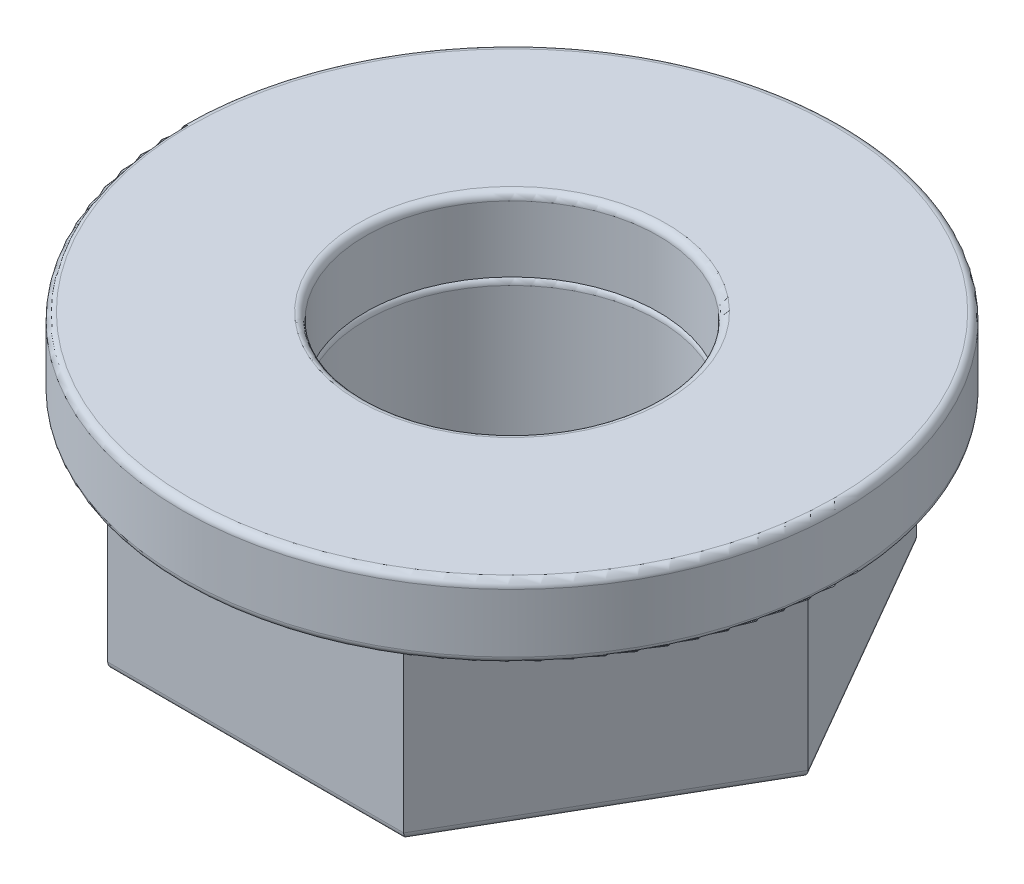
ISO-10303-21;
HEADER;
FILE_DESCRIPTION(('STEP AP214'),'2;1');
FILE_NAME('part.step','',(''),(''),'','','');
FILE_SCHEMA(('AUTOMOTIVE_DESIGN { 1 0 10303 214 1 1 1 1 }'));
ENDSEC;
DATA;
#1=APPLICATION_CONTEXT('core data for automotive mechanical design processes');
#2=APPLICATION_PROTOCOL_DEFINITION('international standard','automotive_design',2000,#1);
#3=PRODUCT_CONTEXT('',#1,'mechanical');
#4=PRODUCT('Part','Part','',(#3));
#5=PRODUCT_RELATED_PRODUCT_CATEGORY('part','',(#4));
#6=PRODUCT_DEFINITION_FORMATION('','',#4);
#7=PRODUCT_DEFINITION_CONTEXT('part definition',#1,'design');
#8=PRODUCT_DEFINITION('design','',#6,#7);
#9=PRODUCT_DEFINITION_SHAPE('','',#8);
#10=(LENGTH_UNIT() NAMED_UNIT(*) SI_UNIT(.MILLI.,.METRE.));
#11=(NAMED_UNIT(*) PLANE_ANGLE_UNIT() SI_UNIT($,.RADIAN.));
#12=(NAMED_UNIT(*) SI_UNIT($,.STERADIAN.) SOLID_ANGLE_UNIT());
#13=UNCERTAINTY_MEASURE_WITH_UNIT(LENGTH_MEASURE(1.E-05),#10,'distance_accuracy_value','');
#14=(GEOMETRIC_REPRESENTATION_CONTEXT(3) GLOBAL_UNCERTAINTY_ASSIGNED_CONTEXT((#13)) GLOBAL_UNIT_ASSIGNED_CONTEXT((#10,
#11,#12)) REPRESENTATION_CONTEXT('',''));
#15=CARTESIAN_POINT('',(0.,0.,0.));
#16=DIRECTION('',(0.,0.,1.));
#17=DIRECTION('',(1.,0.,0.));
#18=AXIS2_PLACEMENT_3D('',#15,#16,#17);
#19=CARTESIAN_POINT('',(0.,0.,0.));
#20=DIRECTION('',(0.,1.,0.));
#21=DIRECTION('',(0.,0.,1.));
#22=AXIS2_PLACEMENT_3D('',#19,#20,#21);
#23=PLANE('',#22);
#24=CARTESIAN_POINT('',(0.,0.,0.));
#25=DIRECTION('',(0.,1.,0.));
#26=DIRECTION('',(0.,0.,1.));
#27=AXIS2_PLACEMENT_3D('',#24,#25,#26);
#28=CIRCLE('',#27,2.1);
#29=CARTESIAN_POINT('',(0.,0.,2.1));
#30=VERTEX_POINT('',#29);
#31=EDGE_CURVE('E375',#30,#30,#28,.T.);
#32=ORIENTED_EDGE('',*,*,#31,.T.);
#33=EDGE_LOOP('',(#32));
#34=FACE_BOUND('',#33,.T.);
#35=DIRECTION('',(-0.5,0.,-0.866025403784438));
#36=VECTOR('',#35,1.);
#37=CARTESIAN_POINT('',(2.94448637286709,0.,-1.7));
#38=LINE('',#37,#36);
#39=CARTESIAN_POINT('',(1.96299091524473,0.,-3.4));
#40=VERTEX_POINT('',#39);
#41=CARTESIAN_POINT('',(3.92598183048946,0.,0.));
#42=VERTEX_POINT('',#41);
#43=EDGE_CURVE('E370',#40,#42,#38,.F.);
#44=ORIENTED_EDGE('',*,*,#43,.T.);
#45=DIRECTION('',(0.5,0.,-0.866025403784439));
#46=VECTOR('',#45,1.);
#47=CARTESIAN_POINT('',(2.94448637286709,0.,1.7));
#48=LINE('',#47,#46);
#49=CARTESIAN_POINT('',(1.96299091524473,0.,3.4));
#50=VERTEX_POINT('',#49);
#51=EDGE_CURVE('E372',#42,#50,#48,.F.);
#52=ORIENTED_EDGE('',*,*,#51,.T.);
#53=DIRECTION('',(1.,0.,0.));
#54=VECTOR('',#53,1.);
#55=CARTESIAN_POINT('',(0.,0.,3.4));
#56=LINE('',#55,#54);
#57=CARTESIAN_POINT('',(-1.96299091524473,0.,3.4));
#58=VERTEX_POINT('',#57);
#59=EDGE_CURVE('E362',#50,#58,#56,.F.);
#60=ORIENTED_EDGE('',*,*,#59,.T.);
#61=DIRECTION('',(0.5,0.,0.866025403784439));
#62=VECTOR('',#61,1.);
#63=CARTESIAN_POINT('',(-2.94448637286709,0.,1.7));
#64=LINE('',#63,#62);
#65=CARTESIAN_POINT('',(-3.92598183048946,0.,0.));
#66=VERTEX_POINT('',#65);
#67=EDGE_CURVE('E364',#58,#66,#64,.F.);
#68=ORIENTED_EDGE('',*,*,#67,.T.);
#69=DIRECTION('',(-0.5,0.,0.866025403784439));
#70=VECTOR('',#69,1.);
#71=CARTESIAN_POINT('',(-2.94448637286709,0.,-1.7));
#72=LINE('',#71,#70);
#73=CARTESIAN_POINT('',(-1.96299091524473,0.,-3.4));
#74=VERTEX_POINT('',#73);
#75=EDGE_CURVE('E366',#66,#74,#72,.F.);
#76=ORIENTED_EDGE('',*,*,#75,.T.);
#77=DIRECTION('',(-1.,0.,0.));
#78=VECTOR('',#77,1.);
#79=CARTESIAN_POINT('',(0.,0.,-3.4));
#80=LINE('',#79,#78);
#81=EDGE_CURVE('E368',#74,#40,#80,.F.);
#82=ORIENTED_EDGE('',*,*,#81,.T.);
#83=EDGE_LOOP('',(#44,#52,#60,#68,#76,#82));
#84=FACE_BOUND('',#83,.T.);
#85=ADVANCED_FACE('F32',(#34,#84),#23,.F.);
#86=CARTESIAN_POINT('',(-2.02072594216369,2.5,3.5));
#87=DIRECTION('',(0.,0.,-1.));
#88=DIRECTION('',(-1.,0.,0.));
#89=AXIS2_PLACEMENT_3D('',#86,#87,#88);
#90=PLANE('',#89);
#91=DIRECTION('',(0.,-1.,0.));
#92=VECTOR('',#91,1.);
#93=CARTESIAN_POINT('',(-2.02072594216369,2.5,3.5));
#94=LINE('',#93,#92);
#95=CARTESIAN_POINT('',(-2.02072594216369,2.4,3.5));
#96=VERTEX_POINT('',#95);
#97=CARTESIAN_POINT('',(-2.02072594216369,0.0999999999999998,3.5));
#98=VERTEX_POINT('',#97);
#99=EDGE_CURVE('E174',#96,#98,#94,.T.);
#100=ORIENTED_EDGE('',*,*,#99,.T.);
#101=DIRECTION('',(1.,0.,0.));
#102=VECTOR('',#101,1.);
#103=CARTESIAN_POINT('',(-2.02072594216369,0.0999999999999998,3.5));
#104=LINE('',#103,#102);
#105=CARTESIAN_POINT('',(2.02072594216369,0.0999999999999998,3.5));
#106=VERTEX_POINT('',#105);
#107=EDGE_CURVE('E135',#98,#106,#104,.T.);
#108=ORIENTED_EDGE('',*,*,#107,.T.);
#109=DIRECTION('',(0.,-1.,0.));
#110=VECTOR('',#109,1.);
#111=CARTESIAN_POINT('',(2.02072594216369,2.5,3.5));
#112=LINE('',#111,#110);
#113=CARTESIAN_POINT('',(2.02072594216369,2.4,3.5));
#114=VERTEX_POINT('',#113);
#115=EDGE_CURVE('E360',#114,#106,#112,.T.);
#116=ORIENTED_EDGE('',*,*,#115,.F.);
#117=DIRECTION('',(1.,0.,0.));
#118=VECTOR('',#117,1.);
#119=CARTESIAN_POINT('',(-2.02072594216369,2.4,3.5));
#120=LINE('',#119,#118);
#121=EDGE_CURVE('E334',#114,#96,#120,.F.);
#122=ORIENTED_EDGE('',*,*,#121,.T.);
#123=EDGE_LOOP('',(#100,#108,#116,#122));
#124=FACE_BOUND('',#123,.T.);
#125=ADVANCED_FACE('F214',(#124),#90,.F.);
#126=CARTESIAN_POINT('',(2.02072594216369,2.5,3.5));
#127=DIRECTION('',(-0.866025403784439,0.,-0.5));
#128=DIRECTION('',(-0.5,0.,0.866025403784439));
#129=AXIS2_PLACEMENT_3D('',#126,#127,#128);
#130=PLANE('',#129);
#131=ORIENTED_EDGE('',*,*,#115,.T.);
#132=DIRECTION('',(0.5,0.,-0.866025403784439));
#133=VECTOR('',#132,1.);
#134=CARTESIAN_POINT('',(2.02072594216369,0.0999999999999998,3.5));
#135=LINE('',#134,#133);
#136=CARTESIAN_POINT('',(4.04145188432738,0.0999999999999998,0.));
#137=VERTEX_POINT('',#136);
#138=EDGE_CURVE('E310',#106,#137,#135,.T.);
#139=ORIENTED_EDGE('',*,*,#138,.T.);
#140=DIRECTION('',(0.,-1.,0.));
#141=VECTOR('',#140,1.);
#142=CARTESIAN_POINT('',(4.04145188432738,2.5,0.));
#143=LINE('',#142,#141);
#144=CARTESIAN_POINT('',(4.04145188432738,2.4,0.));
#145=VERTEX_POINT('',#144);
#146=EDGE_CURVE('E357',#145,#137,#143,.T.);
#147=ORIENTED_EDGE('',*,*,#146,.F.);
#148=DIRECTION('',(0.5,0.,-0.866025403784439));
#149=VECTOR('',#148,1.);
#150=CARTESIAN_POINT('',(2.02072594216369,2.4,3.5));
#151=LINE('',#150,#149);
#152=EDGE_CURVE('E306',#145,#114,#151,.F.);
#153=ORIENTED_EDGE('',*,*,#152,.T.);
#154=EDGE_LOOP('',(#131,#139,#147,#153));
#155=FACE_BOUND('',#154,.T.);
#156=ADVANCED_FACE('F220',(#155),#130,.F.);
#157=CARTESIAN_POINT('',(4.04145188432738,2.5,0.));
#158=DIRECTION('',(-0.866025403784438,0.,0.5));
#159=DIRECTION('',(0.5,0.,0.866025403784438));
#160=AXIS2_PLACEMENT_3D('',#157,#158,#159);
#161=PLANE('',#160);
#162=ORIENTED_EDGE('',*,*,#146,.T.);
#163=DIRECTION('',(-0.5,0.,-0.866025403784438));
#164=VECTOR('',#163,1.);
#165=CARTESIAN_POINT('',(4.04145188432738,0.0999999999999998,0.));
#166=LINE('',#165,#164);
#167=CARTESIAN_POINT('',(2.02072594216369,0.0999999999999998,-3.5));
#168=VERTEX_POINT('',#167);
#169=EDGE_CURVE('E321',#137,#168,#166,.T.);
#170=ORIENTED_EDGE('',*,*,#169,.T.);
#171=DIRECTION('',(0.,-1.,0.));
#172=VECTOR('',#171,1.);
#173=CARTESIAN_POINT('',(2.02072594216369,2.5,-3.5));
#174=LINE('',#173,#172);
#175=CARTESIAN_POINT('',(2.02072594216369,2.4,-3.5));
#176=VERTEX_POINT('',#175);
#177=EDGE_CURVE('E351',#176,#168,#174,.T.);
#178=ORIENTED_EDGE('',*,*,#177,.F.);
#179=DIRECTION('',(-0.5,0.,-0.866025403784438));
#180=VECTOR('',#179,1.);
#181=CARTESIAN_POINT('',(4.04145188432738,2.4,0.));
#182=LINE('',#181,#180);
#183=EDGE_CURVE('E303',#176,#145,#182,.F.);
#184=ORIENTED_EDGE('',*,*,#183,.T.);
#185=EDGE_LOOP('',(#162,#170,#178,#184));
#186=FACE_BOUND('',#185,.T.);
#187=ADVANCED_FACE('F240',(#186),#161,.F.);
#188=CARTESIAN_POINT('',(2.02072594216369,2.5,-3.5));
#189=DIRECTION('',(0.,0.,1.));
#190=DIRECTION('',(1.,0.,0.));
#191=AXIS2_PLACEMENT_3D('',#188,#189,#190);
#192=PLANE('',#191);
#193=ORIENTED_EDGE('',*,*,#177,.T.);
#194=DIRECTION('',(-1.,0.,0.));
#195=VECTOR('',#194,1.);
#196=CARTESIAN_POINT('',(2.02072594216369,0.0999999999999998,-3.5));
#197=LINE('',#196,#195);
#198=CARTESIAN_POINT('',(-2.02072594216369,0.0999999999999998,-3.5));
#199=VERTEX_POINT('',#198);
#200=EDGE_CURVE('E325',#168,#199,#197,.T.);
#201=ORIENTED_EDGE('',*,*,#200,.T.);
#202=DIRECTION('',(0.,-1.,0.));
#203=VECTOR('',#202,1.);
#204=CARTESIAN_POINT('',(-2.02072594216369,2.5,-3.5));
#205=LINE('',#204,#203);
#206=CARTESIAN_POINT('',(-2.02072594216369,2.4,-3.5));
#207=VERTEX_POINT('',#206);
#208=EDGE_CURVE('E349',#207,#199,#205,.T.);
#209=ORIENTED_EDGE('',*,*,#208,.F.);
#210=DIRECTION('',(-1.,0.,0.));
#211=VECTOR('',#210,1.);
#212=CARTESIAN_POINT('',(2.02072594216369,2.4,-3.5));
#213=LINE('',#212,#211);
#214=EDGE_CURVE('E323',#207,#176,#213,.F.);
#215=ORIENTED_EDGE('',*,*,#214,.T.);
#216=EDGE_LOOP('',(#193,#201,#209,#215));
#217=FACE_BOUND('',#216,.T.);
#218=ADVANCED_FACE('F236',(#217),#192,.F.);
#219=CARTESIAN_POINT('',(-2.02072594216369,2.5,-3.5));
#220=DIRECTION('',(0.866025403784439,0.,0.5));
#221=DIRECTION('',(0.5,0.,-0.866025403784439));
#222=AXIS2_PLACEMENT_3D('',#219,#220,#221);
#223=PLANE('',#222);
#224=ORIENTED_EDGE('',*,*,#208,.T.);
#225=DIRECTION('',(-0.5,0.,0.866025403784439));
#226=VECTOR('',#225,1.);
#227=CARTESIAN_POINT('',(-2.02072594216369,0.0999999999999998,-3.5));
#228=LINE('',#227,#226);
#229=CARTESIAN_POINT('',(-4.04145188432738,0.0999999999999998,0.));
#230=VERTEX_POINT('',#229);
#231=EDGE_CURVE('E329',#199,#230,#228,.T.);
#232=ORIENTED_EDGE('',*,*,#231,.T.);
#233=DIRECTION('',(0.,-1.,0.));
#234=VECTOR('',#233,1.);
#235=CARTESIAN_POINT('',(-4.04145188432738,2.5,0.));
#236=LINE('',#235,#234);
#237=CARTESIAN_POINT('',(-4.04145188432738,2.4,0.));
#238=VERTEX_POINT('',#237);
#239=EDGE_CURVE('E345',#238,#230,#236,.T.);
#240=ORIENTED_EDGE('',*,*,#239,.F.);
#241=DIRECTION('',(-0.5,0.,0.866025403784439));
#242=VECTOR('',#241,1.);
#243=CARTESIAN_POINT('',(-2.02072594216369,2.4,-3.5));
#244=LINE('',#243,#242);
#245=EDGE_CURVE('E327',#238,#207,#244,.F.);
#246=ORIENTED_EDGE('',*,*,#245,.T.);
#247=EDGE_LOOP('',(#224,#232,#240,#246));
#248=FACE_BOUND('',#247,.T.);
#249=ADVANCED_FACE('F232',(#248),#223,.F.);
#250=CARTESIAN_POINT('',(-4.04145188432738,2.5,0.));
#251=DIRECTION('',(0.866025403784439,0.,-0.5));
#252=DIRECTION('',(-0.5,0.,-0.866025403784439));
#253=AXIS2_PLACEMENT_3D('',#250,#251,#252);
#254=PLANE('',#253);
#255=ORIENTED_EDGE('',*,*,#239,.T.);
#256=DIRECTION('',(0.5,0.,0.866025403784439));
#257=VECTOR('',#256,1.);
#258=CARTESIAN_POINT('',(-4.04145188432738,0.0999999999999998,0.));
#259=LINE('',#258,#257);
#260=EDGE_CURVE('E332',#230,#98,#259,.T.);
#261=ORIENTED_EDGE('',*,*,#260,.T.);
#262=ORIENTED_EDGE('',*,*,#99,.F.);
#263=DIRECTION('',(0.5,0.,0.866025403784439));
#264=VECTOR('',#263,1.);
#265=CARTESIAN_POINT('',(-4.04145188432738,2.4,0.));
#266=LINE('',#265,#264);
#267=EDGE_CURVE('E143',#96,#238,#266,.F.);
#268=ORIENTED_EDGE('',*,*,#267,.T.);
#269=EDGE_LOOP('',(#255,#261,#262,#268));
#270=FACE_BOUND('',#269,.T.);
#271=ADVANCED_FACE('F229',(#270),#254,.F.);
#272=CARTESIAN_POINT('',(0.,2.5,0.));
#273=DIRECTION('',(0.,-1.,0.));
#274=DIRECTION('',(0.,0.,-1.));
#275=AXIS2_PLACEMENT_3D('',#272,#273,#274);
#276=CYLINDRICAL_SURFACE('',#275,2.);
#277=CARTESIAN_POINT('',(0.,0.0999999999999998,0.));
#278=DIRECTION('',(0.,1.,0.));
#279=DIRECTION('',(0.,0.,1.));
#280=AXIS2_PLACEMENT_3D('',#277,#278,#279);
#281=CIRCLE('',#280,2.);
#282=CARTESIAN_POINT('',(0.,0.0999999999999998,2.));
#283=VERTEX_POINT('',#282);
#284=EDGE_CURVE('E311',#283,#283,#281,.F.);
#285=ORIENTED_EDGE('',*,*,#284,.T.);
#286=EDGE_LOOP('',(#285));
#287=FACE_BOUND('',#286,.T.);
#288=CARTESIAN_POINT('',(0.,2.4,0.));
#289=DIRECTION('',(0.,1.,0.));
#290=DIRECTION('',(0.,0.,1.));
#291=AXIS2_PLACEMENT_3D('',#288,#289,#290);
#292=CIRCLE('',#291,2.);
#293=CARTESIAN_POINT('',(0.,2.4,2.));
#294=VERTEX_POINT('',#293);
#295=EDGE_CURVE('E316',#294,#294,#292,.T.);
#296=ORIENTED_EDGE('',*,*,#295,.T.);
#297=EDGE_LOOP('',(#296));
#298=FACE_BOUND('',#297,.T.);
#299=ADVANCED_FACE('F227',(#287,#298),#276,.F.);
#300=CARTESIAN_POINT('',(0.,0.0999999999999998,0.));
#301=DIRECTION('',(0.,1.,0.));
#302=DIRECTION('',(0.,0.,1.));
#303=AXIS2_PLACEMENT_3D('',#300,#301,#302);
#304=TOROIDAL_SURFACE('',#303,2.1,0.1);
#305=ORIENTED_EDGE('',*,*,#284,.F.);
#306=EDGE_LOOP('',(#305));
#307=FACE_BOUND('',#306,.T.);
#308=ORIENTED_EDGE('',*,*,#31,.F.);
#309=EDGE_LOOP('',(#308));
#310=FACE_BOUND('',#309,.T.);
#311=ADVANCED_FACE('F248',(#307,#310),#304,.T.);
#312=CARTESIAN_POINT('',(-1.93412340178525,0.0999999999999998,-3.45));
#313=DIRECTION('',(-0.5,0.,0.866025403784439));
#314=DIRECTION('',(0.866025403784439,0.,0.5));
#315=AXIS2_PLACEMENT_3D('',#312,#313,#314);
#316=CYLINDRICAL_SURFACE('',#315,0.1);
#317=CARTESIAN_POINT('',(-1.96299091524473,0.0999999999999998,-3.4));
#318=DIRECTION('',(-0.866025403784438,0.,0.5));
#319=DIRECTION('',(0.5,0.,0.866025403784439));
#320=AXIS2_PLACEMENT_3D('',#317,#318,#319);
#321=ELLIPSE('',#320,0.115470053837925,0.1);
#322=EDGE_CURVE('E169',#74,#199,#321,.F.);
#323=ORIENTED_EDGE('',*,*,#322,.F.);
#324=ORIENTED_EDGE('',*,*,#75,.F.);
#325=CARTESIAN_POINT('',(-3.92598183048946,0.0999999999999998,0.));
#326=DIRECTION('',(0.,0.,1.));
#327=DIRECTION('',(1.,0.,0.));
#328=AXIS2_PLACEMENT_3D('',#325,#326,#327);
#329=ELLIPSE('',#328,0.115470053837925,0.1);
#330=EDGE_CURVE('E172',#230,#66,#329,.T.);
#331=ORIENTED_EDGE('',*,*,#330,.F.);
#332=ORIENTED_EDGE('',*,*,#231,.F.);
#333=EDGE_LOOP('',(#323,#324,#331,#332));
#334=FACE_BOUND('',#333,.T.);
#335=ADVANCED_FACE('F251',(#334),#316,.T.);
#336=CARTESIAN_POINT('',(-3.95484934394894,0.0999999999999998,-0.0500000000000002));
#337=DIRECTION('',(0.5,0.,0.866025403784439));
#338=DIRECTION('',(0.866025403784439,0.,-0.5));
#339=AXIS2_PLACEMENT_3D('',#336,#337,#338);
#340=CYLINDRICAL_SURFACE('',#339,0.1);
#341=ORIENTED_EDGE('',*,*,#330,.T.);
#342=ORIENTED_EDGE('',*,*,#67,.F.);
#343=CARTESIAN_POINT('',(-1.96299091524473,0.0999999999999998,3.4));
#344=DIRECTION('',(0.866025403784439,0.,0.5));
#345=DIRECTION('',(0.5,0.,-0.866025403784439));
#346=AXIS2_PLACEMENT_3D('',#343,#344,#345);
#347=ELLIPSE('',#346,0.115470053837925,0.1);
#348=EDGE_CURVE('E166',#98,#58,#347,.T.);
#349=ORIENTED_EDGE('',*,*,#348,.F.);
#350=ORIENTED_EDGE('',*,*,#260,.F.);
#351=EDGE_LOOP('',(#341,#342,#349,#350));
#352=FACE_BOUND('',#351,.T.);
#353=ADVANCED_FACE('F269',(#352),#340,.T.);
#354=CARTESIAN_POINT('',(2.02072594216369,0.0999999999999998,-3.4));
#355=DIRECTION('',(-1.,0.,0.));
#356=DIRECTION('',(0.,0.,1.));
#357=AXIS2_PLACEMENT_3D('',#354,#355,#356);
#358=CYLINDRICAL_SURFACE('',#357,0.1);
#359=ORIENTED_EDGE('',*,*,#322,.T.);
#360=ORIENTED_EDGE('',*,*,#200,.F.);
#361=CARTESIAN_POINT('',(1.96299091524472,0.0999999999999998,-3.4));
#362=DIRECTION('',(-0.866025403784439,0.,-0.5));
#363=DIRECTION('',(-0.5,0.,0.866025403784439));
#364=AXIS2_PLACEMENT_3D('',#361,#362,#363);
#365=ELLIPSE('',#364,0.115470053837925,0.1);
#366=EDGE_CURVE('E163',#40,#168,#365,.F.);
#367=ORIENTED_EDGE('',*,*,#366,.F.);
#368=ORIENTED_EDGE('',*,*,#81,.F.);
#369=EDGE_LOOP('',(#359,#360,#367,#368));
#370=FACE_BOUND('',#369,.T.);
#371=ADVANCED_FACE('F265',(#370),#358,.T.);
#372=CARTESIAN_POINT('',(-2.02072594216369,0.0999999999999998,3.4));
#373=DIRECTION('',(1.,0.,0.));
#374=DIRECTION('',(0.,0.,-1.));
#375=AXIS2_PLACEMENT_3D('',#372,#373,#374);
#376=CYLINDRICAL_SURFACE('',#375,0.1);
#377=ORIENTED_EDGE('',*,*,#348,.T.);
#378=ORIENTED_EDGE('',*,*,#59,.F.);
#379=CARTESIAN_POINT('',(1.96299091524473,0.0999999999999998,3.4));
#380=DIRECTION('',(0.866025403784438,0.,-0.5));
#381=DIRECTION('',(0.5,0.,0.866025403784439));
#382=AXIS2_PLACEMENT_3D('',#379,#380,#381);
#383=ELLIPSE('',#382,0.115470053837925,0.1);
#384=EDGE_CURVE('E160',#106,#50,#383,.T.);
#385=ORIENTED_EDGE('',*,*,#384,.F.);
#386=ORIENTED_EDGE('',*,*,#107,.F.);
#387=EDGE_LOOP('',(#377,#378,#385,#386));
#388=FACE_BOUND('',#387,.T.);
#389=ADVANCED_FACE('F261',(#388),#376,.T.);
#390=CARTESIAN_POINT('',(3.95484934394894,0.0999999999999998,0.0499999999999988));
#391=DIRECTION('',(-0.5,0.,-0.866025403784438));
#392=DIRECTION('',(-0.866025403784438,0.,0.5));
#393=AXIS2_PLACEMENT_3D('',#390,#391,#392);
#394=CYLINDRICAL_SURFACE('',#393,0.1);
#395=ORIENTED_EDGE('',*,*,#366,.T.);
#396=ORIENTED_EDGE('',*,*,#169,.F.);
#397=CARTESIAN_POINT('',(3.92598183048946,0.0999999999999998,0.));
#398=DIRECTION('',(0.,0.,-1.));
#399=DIRECTION('',(-1.,0.,0.));
#400=AXIS2_PLACEMENT_3D('',#397,#398,#399);
#401=ELLIPSE('',#400,0.115470053837925,0.1);
#402=EDGE_CURVE('E158',#42,#137,#401,.F.);
#403=ORIENTED_EDGE('',*,*,#402,.F.);
#404=ORIENTED_EDGE('',*,*,#43,.F.);
#405=EDGE_LOOP('',(#395,#396,#403,#404));
#406=FACE_BOUND('',#405,.T.);
#407=ADVANCED_FACE('F257',(#406),#394,.T.);
#408=CARTESIAN_POINT('',(1.93412340178525,0.0999999999999998,3.45));
#409=DIRECTION('',(0.5,0.,-0.866025403784439));
#410=DIRECTION('',(-0.866025403784439,0.,-0.5));
#411=AXIS2_PLACEMENT_3D('',#408,#409,#410);
#412=CYLINDRICAL_SURFACE('',#411,0.1);
#413=ORIENTED_EDGE('',*,*,#384,.T.);
#414=ORIENTED_EDGE('',*,*,#51,.F.);
#415=ORIENTED_EDGE('',*,*,#402,.T.);
#416=ORIENTED_EDGE('',*,*,#138,.F.);
#417=EDGE_LOOP('',(#413,#414,#415,#416));
#418=FACE_BOUND('',#417,.T.);
#419=ADVANCED_FACE('F253',(#418),#412,.T.);
#420=CARTESIAN_POINT('',(0.,2.4,0.));
#421=DIRECTION('',(0.,1.,0.));
#422=DIRECTION('',(0.,0.,1.));
#423=AXIS2_PLACEMENT_3D('',#420,#421,#422);
#424=TOROIDAL_SURFACE('',#423,2.1,0.1);
#425=CARTESIAN_POINT('',(0.,2.5,0.));
#426=DIRECTION('',(0.,1.,0.));
#427=DIRECTION('',(0.,0.,1.));
#428=AXIS2_PLACEMENT_3D('',#425,#426,#427);
#429=CIRCLE('',#428,2.1);
#430=CARTESIAN_POINT('',(0.,2.5,2.1));
#431=VERTEX_POINT('',#430);
#432=EDGE_CURVE('E149',#431,#431,#429,.F.);
#433=ORIENTED_EDGE('',*,*,#432,.F.);
#434=EDGE_LOOP('',(#433));
#435=FACE_BOUND('',#434,.T.);
#436=ORIENTED_EDGE('',*,*,#295,.F.);
#437=EDGE_LOOP('',(#436));
#438=FACE_BOUND('',#437,.T.);
#439=ADVANCED_FACE('F256',(#435,#438),#424,.T.);
#440=CARTESIAN_POINT('',(2.94448637286709,2.4,-1.7));
#441=DIRECTION('',(0.5,0.,0.866025403784438));
#442=DIRECTION('',(0.866025403784438,0.,-0.5));
#443=AXIS2_PLACEMENT_3D('',#440,#441,#442);
#444=CYLINDRICAL_SURFACE('',#443,0.1);
#445=CARTESIAN_POINT('',(3.92598183048946,2.4,0.));
#446=DIRECTION('',(0.,0.,1.));
#447=DIRECTION('',(-1.,0.,0.));
#448=AXIS2_PLACEMENT_3D('',#445,#446,#447);
#449=ELLIPSE('',#448,0.115470053837925,0.1);
#450=CARTESIAN_POINT('',(3.92598183048946,2.5,0.));
#451=VERTEX_POINT('',#450);
#452=EDGE_CURVE('E179',#145,#451,#449,.T.);
#453=ORIENTED_EDGE('',*,*,#452,.F.);
#454=ORIENTED_EDGE('',*,*,#183,.F.);
#455=CARTESIAN_POINT('',(1.96299091524472,2.4,-3.4));
#456=DIRECTION('',(0.866025403784439,0.,0.5));
#457=DIRECTION('',(-0.5,0.,0.866025403784439));
#458=AXIS2_PLACEMENT_3D('',#455,#456,#457);
#459=ELLIPSE('',#458,0.115470053837925,0.1);
#460=CARTESIAN_POINT('',(1.96299091524473,2.5,-3.4));
#461=VERTEX_POINT('',#460);
#462=EDGE_CURVE('E161',#461,#176,#459,.F.);
#463=ORIENTED_EDGE('',*,*,#462,.F.);
#464=DIRECTION('',(-0.5,0.,-0.866025403784438));
#465=VECTOR('',#464,1.);
#466=CARTESIAN_POINT('',(1.93412340178524,2.5,-3.45));
#467=LINE('',#466,#465);
#468=EDGE_CURVE('E305',#451,#461,#467,.T.);
#469=ORIENTED_EDGE('',*,*,#468,.F.);
#470=EDGE_LOOP('',(#453,#454,#463,#469));
#471=FACE_BOUND('',#470,.T.);
#472=ADVANCED_FACE('F279',(#471),#444,.T.);
#473=CARTESIAN_POINT('',(0.,2.4,-3.4));
#474=DIRECTION('',(1.,0.,0.));
#475=DIRECTION('',(0.,0.,-1.));
#476=AXIS2_PLACEMENT_3D('',#473,#474,#475);
#477=CYLINDRICAL_SURFACE('',#476,0.1);
#478=ORIENTED_EDGE('',*,*,#462,.T.);
#479=ORIENTED_EDGE('',*,*,#214,.F.);
#480=CARTESIAN_POINT('',(-1.96299091524473,2.4,-3.4));
#481=DIRECTION('',(0.866025403784438,0.,-0.5));
#482=DIRECTION('',(0.5,0.,0.866025403784439));
#483=AXIS2_PLACEMENT_3D('',#480,#481,#482);
#484=ELLIPSE('',#483,0.115470053837925,0.1);
#485=CARTESIAN_POINT('',(-1.96299091524473,2.5,-3.4));
#486=VERTEX_POINT('',#485);
#487=EDGE_CURVE('E55',#486,#207,#484,.F.);
#488=ORIENTED_EDGE('',*,*,#487,.F.);
#489=DIRECTION('',(-1.,0.,0.));
#490=VECTOR('',#489,1.);
#491=CARTESIAN_POINT('',(-2.02072594216369,2.5,-3.4));
#492=LINE('',#491,#490);
#493=EDGE_CURVE('E154',#461,#486,#492,.T.);
#494=ORIENTED_EDGE('',*,*,#493,.F.);
#495=EDGE_LOOP('',(#478,#479,#488,#494));
#496=FACE_BOUND('',#495,.T.);
#497=ADVANCED_FACE('F292',(#496),#477,.T.);
#498=CARTESIAN_POINT('',(2.94448637286709,2.4,1.7));
#499=DIRECTION('',(-0.5,0.,0.866025403784439));
#500=DIRECTION('',(0.866025403784439,0.,0.5));
#501=AXIS2_PLACEMENT_3D('',#498,#499,#500);
#502=CYLINDRICAL_SURFACE('',#501,0.1);
#503=ORIENTED_EDGE('',*,*,#452,.T.);
#504=DIRECTION('',(0.5,0.,-0.866025403784439));
#505=VECTOR('',#504,1.);
#506=CARTESIAN_POINT('',(3.95484934394894,2.5,-0.0500000000000021));
#507=LINE('',#506,#505);
#508=CARTESIAN_POINT('',(1.96299091524473,2.5,3.4));
#509=VERTEX_POINT('',#508);
#510=EDGE_CURVE('E134',#509,#451,#507,.T.);
#511=ORIENTED_EDGE('',*,*,#510,.F.);
#512=CARTESIAN_POINT('',(1.96299091524473,2.4,3.4));
#513=DIRECTION('',(-0.866025403784438,0.,0.5));
#514=DIRECTION('',(-0.5,0.,-0.866025403784439));
#515=AXIS2_PLACEMENT_3D('',#512,#513,#514);
#516=ELLIPSE('',#515,0.115470053837925,0.1);
#517=EDGE_CURVE('E130',#114,#509,#516,.T.);
#518=ORIENTED_EDGE('',*,*,#517,.F.);
#519=ORIENTED_EDGE('',*,*,#152,.F.);
#520=EDGE_LOOP('',(#503,#511,#518,#519));
#521=FACE_BOUND('',#520,.T.);
#522=ADVANCED_FACE('F289',(#521),#502,.T.);
#523=CARTESIAN_POINT('',(-2.94448637286709,2.4,-1.7));
#524=DIRECTION('',(0.5,0.,-0.866025403784439));
#525=DIRECTION('',(-0.866025403784439,0.,-0.5));
#526=AXIS2_PLACEMENT_3D('',#523,#524,#525);
#527=CYLINDRICAL_SURFACE('',#526,0.1);
#528=ORIENTED_EDGE('',*,*,#487,.T.);
#529=ORIENTED_EDGE('',*,*,#245,.F.);
#530=CARTESIAN_POINT('',(-3.92598183048946,2.4,0.));
#531=DIRECTION('',(0.,0.,-1.));
#532=DIRECTION('',(1.,0.,0.));
#533=AXIS2_PLACEMENT_3D('',#530,#531,#532);
#534=ELLIPSE('',#533,0.115470053837925,0.1);
#535=CARTESIAN_POINT('',(-3.92598183048946,2.5,0.));
#536=VERTEX_POINT('',#535);
#537=EDGE_CURVE('E47',#536,#238,#534,.F.);
#538=ORIENTED_EDGE('',*,*,#537,.F.);
#539=DIRECTION('',(-0.5,0.,0.866025403784439));
#540=VECTOR('',#539,1.);
#541=CARTESIAN_POINT('',(-3.95484934394894,2.5,0.0500000000000008));
#542=LINE('',#541,#540);
#543=EDGE_CURVE('E148',#486,#536,#542,.T.);
#544=ORIENTED_EDGE('',*,*,#543,.F.);
#545=EDGE_LOOP('',(#528,#529,#538,#544));
#546=FACE_BOUND('',#545,.T.);
#547=ADVANCED_FACE('F286',(#546),#527,.T.);
#548=CARTESIAN_POINT('',(0.,2.4,3.4));
#549=DIRECTION('',(-1.,0.,0.));
#550=DIRECTION('',(0.,0.,1.));
#551=AXIS2_PLACEMENT_3D('',#548,#549,#550);
#552=CYLINDRICAL_SURFACE('',#551,0.1);
#553=ORIENTED_EDGE('',*,*,#517,.T.);
#554=DIRECTION('',(1.,0.,0.));
#555=VECTOR('',#554,1.);
#556=CARTESIAN_POINT('',(2.02072594216369,2.5,3.4));
#557=LINE('',#556,#555);
#558=CARTESIAN_POINT('',(-1.96299091524473,2.5,3.4));
#559=VERTEX_POINT('',#558);
#560=EDGE_CURVE('E124',#559,#509,#557,.T.);
#561=ORIENTED_EDGE('',*,*,#560,.F.);
#562=CARTESIAN_POINT('',(-1.96299091524473,2.4,3.4));
#563=DIRECTION('',(-0.866025403784439,0.,-0.5));
#564=DIRECTION('',(-0.5,0.,0.866025403784439));
#565=AXIS2_PLACEMENT_3D('',#562,#563,#564);
#566=ELLIPSE('',#565,0.115470053837925,0.1);
#567=EDGE_CURVE('E128',#96,#559,#566,.T.);
#568=ORIENTED_EDGE('',*,*,#567,.F.);
#569=ORIENTED_EDGE('',*,*,#121,.F.);
#570=EDGE_LOOP('',(#553,#561,#568,#569));
#571=FACE_BOUND('',#570,.T.);
#572=ADVANCED_FACE('F126',(#571),#552,.T.);
#573=CARTESIAN_POINT('',(-2.94448637286709,2.4,1.7));
#574=DIRECTION('',(-0.5,0.,-0.866025403784439));
#575=DIRECTION('',(-0.866025403784439,0.,0.5));
#576=AXIS2_PLACEMENT_3D('',#573,#574,#575);
#577=CYLINDRICAL_SURFACE('',#576,0.1);
#578=ORIENTED_EDGE('',*,*,#537,.T.);
#579=ORIENTED_EDGE('',*,*,#267,.F.);
#580=ORIENTED_EDGE('',*,*,#567,.T.);
#581=DIRECTION('',(0.5,0.,0.866025403784439));
#582=VECTOR('',#581,1.);
#583=CARTESIAN_POINT('',(-1.93412340178525,2.5,3.45));
#584=LINE('',#583,#582);
#585=EDGE_CURVE('E140',#536,#559,#584,.T.);
#586=ORIENTED_EDGE('',*,*,#585,.F.);
#587=EDGE_LOOP('',(#578,#579,#580,#586));
#588=FACE_BOUND('',#587,.T.);
#589=ADVANCED_FACE('F139',(#588),#577,.T.);
#590=CARTESIAN_POINT('',(0.,2.5,0.));
#591=DIRECTION('',(0.,1.,0.));
#592=DIRECTION('',(0.,0.,1.));
#593=AXIS2_PLACEMENT_3D('',#590,#591,#592);
#594=PLANE('',#593);
#595=CARTESIAN_POINT('',(0.,2.5,0.));
#596=DIRECTION('',(0.,1.,0.));
#597=DIRECTION('',(0.,0.,1.));
#598=AXIS2_PLACEMENT_3D('',#595,#596,#597);
#599=CIRCLE('',#598,2.);
#600=CARTESIAN_POINT('',(0.,2.5,2.));
#601=VERTEX_POINT('',#600);
#602=EDGE_CURVE('E144',#601,#601,#599,.T.);
#603=ORIENTED_EDGE('',*,*,#602,.T.);
#604=EDGE_LOOP('',(#603));
#605=FACE_BOUND('',#604,.T.);
#606=ORIENTED_EDGE('',*,*,#432,.T.);
#607=EDGE_LOOP('',(#606));
#608=FACE_BOUND('',#607,.T.);
#609=ADVANCED_FACE('F283',(#605,#608),#594,.F.);
#610=CARTESIAN_POINT('',(0.,2.5,0.));
#611=DIRECTION('',(0.,1.,0.));
#612=DIRECTION('',(0.,0.,1.));
#613=AXIS2_PLACEMENT_3D('',#610,#611,#612);
#614=CIRCLE('',#613,4.4);
#615=CARTESIAN_POINT('',(0.,2.5,4.4));
#616=VERTEX_POINT('',#615);
#617=EDGE_CURVE('E11',#616,#616,#614,.F.);
#618=ORIENTED_EDGE('',*,*,#617,.T.);
#619=EDGE_LOOP('',(#618));
#620=FACE_BOUND('',#619,.T.);
#621=ORIENTED_EDGE('',*,*,#510,.T.);
#622=ORIENTED_EDGE('',*,*,#468,.T.);
#623=ORIENTED_EDGE('',*,*,#493,.T.);
#624=ORIENTED_EDGE('',*,*,#543,.T.);
#625=ORIENTED_EDGE('',*,*,#585,.T.);
#626=ORIENTED_EDGE('',*,*,#560,.T.);
#627=EDGE_LOOP('',(#621,#622,#623,#624,#625,#626));
#628=FACE_BOUND('',#627,.T.);
#629=ADVANCED_FACE('F146',(#620,#628),#594,.F.);
#630=CARTESIAN_POINT('',(0.,3.5,0.));
#631=DIRECTION('',(0.,1.,0.));
#632=DIRECTION('',(0.,0.,1.));
#633=AXIS2_PLACEMENT_3D('',#630,#631,#632);
#634=PLANE('',#633);
#635=CARTESIAN_POINT('',(0.,3.5,0.));
#636=DIRECTION('',(0.,1.,0.));
#637=DIRECTION('',(0.,0.,1.));
#638=AXIS2_PLACEMENT_3D('',#635,#636,#637);
#639=CIRCLE('',#638,2.1);
#640=CARTESIAN_POINT('',(0.,3.5,2.1));
#641=VERTEX_POINT('',#640);
#642=EDGE_CURVE('E189',#641,#641,#639,.F.);
#643=ORIENTED_EDGE('',*,*,#642,.T.);
#644=EDGE_LOOP('',(#643));
#645=FACE_BOUND('',#644,.T.);
#646=CARTESIAN_POINT('',(0.,3.5,0.));
#647=DIRECTION('',(0.,1.,0.));
#648=DIRECTION('',(0.,0.,1.));
#649=AXIS2_PLACEMENT_3D('',#646,#647,#648);
#650=CIRCLE('',#649,4.4);
#651=CARTESIAN_POINT('',(0.,3.5,4.4));
#652=VERTEX_POINT('',#651);
#653=EDGE_CURVE('E186',#652,#652,#650,.T.);
#654=ORIENTED_EDGE('',*,*,#653,.T.);
#655=EDGE_LOOP('',(#654));
#656=FACE_BOUND('',#655,.T.);
#657=ADVANCED_FACE('F473',(#645,#656),#634,.T.);
#658=CARTESIAN_POINT('',(0.,3.5,0.));
#659=DIRECTION('',(0.,-1.,0.));
#660=DIRECTION('',(0.,0.,-1.));
#661=AXIS2_PLACEMENT_3D('',#658,#659,#660);
#662=CYLINDRICAL_SURFACE('',#661,4.5);
#663=CARTESIAN_POINT('',(0.,2.6,0.));
#664=DIRECTION('',(0.,1.,0.));
#665=DIRECTION('',(0.,0.,1.));
#666=AXIS2_PLACEMENT_3D('',#663,#664,#665);
#667=CIRCLE('',#666,4.5);
#668=CARTESIAN_POINT('',(0.,2.6,4.5));
#669=VERTEX_POINT('',#668);
#670=EDGE_CURVE('E40',#669,#669,#667,.T.);
#671=ORIENTED_EDGE('',*,*,#670,.T.);
#672=EDGE_LOOP('',(#671));
#673=FACE_BOUND('',#672,.T.);
#674=CARTESIAN_POINT('',(0.,3.4,0.));
#675=DIRECTION('',(0.,1.,0.));
#676=DIRECTION('',(0.,0.,1.));
#677=AXIS2_PLACEMENT_3D('',#674,#675,#676);
#678=CIRCLE('',#677,4.5);
#679=CARTESIAN_POINT('',(0.,3.4,4.5));
#680=VERTEX_POINT('',#679);
#681=EDGE_CURVE('E192',#680,#680,#678,.F.);
#682=ORIENTED_EDGE('',*,*,#681,.T.);
#683=EDGE_LOOP('',(#682));
#684=FACE_BOUND('',#683,.T.);
#685=ADVANCED_FACE('F197',(#673,#684),#662,.T.);
#686=CARTESIAN_POINT('',(0.,3.5,0.));
#687=DIRECTION('',(0.,-1.,0.));
#688=DIRECTION('',(0.,0.,-1.));
#689=AXIS2_PLACEMENT_3D('',#686,#687,#688);
#690=CYLINDRICAL_SURFACE('',#689,2.);
#691=CARTESIAN_POINT('',(0.,3.4,0.));
#692=DIRECTION('',(0.,1.,0.));
#693=DIRECTION('',(0.,0.,1.));
#694=AXIS2_PLACEMENT_3D('',#691,#692,#693);
#695=CIRCLE('',#694,2.);
#696=CARTESIAN_POINT('',(0.,3.4,2.));
#697=VERTEX_POINT('',#696);
#698=EDGE_CURVE('E152',#697,#697,#695,.T.);
#699=ORIENTED_EDGE('',*,*,#698,.T.);
#700=EDGE_LOOP('',(#699));
#701=FACE_BOUND('',#700,.T.);
#702=ORIENTED_EDGE('',*,*,#602,.F.);
#703=EDGE_LOOP('',(#702));
#704=FACE_BOUND('',#703,.T.);
#705=ADVANCED_FACE('F209',(#701,#704),#690,.F.);
#706=CARTESIAN_POINT('',(0.,3.4,0.));
#707=DIRECTION('',(0.,1.,0.));
#708=DIRECTION('',(0.,0.,1.));
#709=AXIS2_PLACEMENT_3D('',#706,#707,#708);
#710=TOROIDAL_SURFACE('',#709,2.1,0.1);
#711=ORIENTED_EDGE('',*,*,#642,.F.);
#712=EDGE_LOOP('',(#711));
#713=FACE_BOUND('',#712,.T.);
#714=ORIENTED_EDGE('',*,*,#698,.F.);
#715=EDGE_LOOP('',(#714));
#716=FACE_BOUND('',#715,.T.);
#717=ADVANCED_FACE('F202',(#713,#716),#710,.T.);
#718=CARTESIAN_POINT('',(0.,2.6,0.));
#719=DIRECTION('',(0.,1.,0.));
#720=DIRECTION('',(0.,0.,1.));
#721=AXIS2_PLACEMENT_3D('',#718,#719,#720);
#722=TOROIDAL_SURFACE('',#721,4.4,0.1);
#723=ORIENTED_EDGE('',*,*,#617,.F.);
#724=EDGE_LOOP('',(#723));
#725=FACE_BOUND('',#724,.T.);
#726=ORIENTED_EDGE('',*,*,#670,.F.);
#727=EDGE_LOOP('',(#726));
#728=FACE_BOUND('',#727,.T.);
#729=ADVANCED_FACE('F200',(#725,#728),#722,.T.);
#730=CARTESIAN_POINT('',(0.,3.4,0.));
#731=DIRECTION('',(0.,1.,0.));
#732=DIRECTION('',(0.,0.,1.));
#733=AXIS2_PLACEMENT_3D('',#730,#731,#732);
#734=TOROIDAL_SURFACE('',#733,4.4,0.1);
#735=ORIENTED_EDGE('',*,*,#681,.F.);
#736=EDGE_LOOP('',(#735));
#737=FACE_BOUND('',#736,.T.);
#738=ORIENTED_EDGE('',*,*,#653,.F.);
#739=EDGE_LOOP('',(#738));
#740=FACE_BOUND('',#739,.T.);
#741=ADVANCED_FACE('F34',(#737,#740),#734,.T.);
#742=CLOSED_SHELL('',(#85,#125,#156,#187,#218,#249,#271,#299,#311,#335,#353,#371,#389,#407,#419,
#439,#472,#497,#522,#547,#572,#589,#609,#629,#657,#685,#705,#717,#729,#741));
#743=MANIFOLD_SOLID_BREP('B2',#742);
#744=ADVANCED_BREP_SHAPE_REPRESENTATION('',(#18,#743),#14);
#745=SHAPE_DEFINITION_REPRESENTATION(#9,#744);
ENDSEC;
END-ISO-10303-21;
